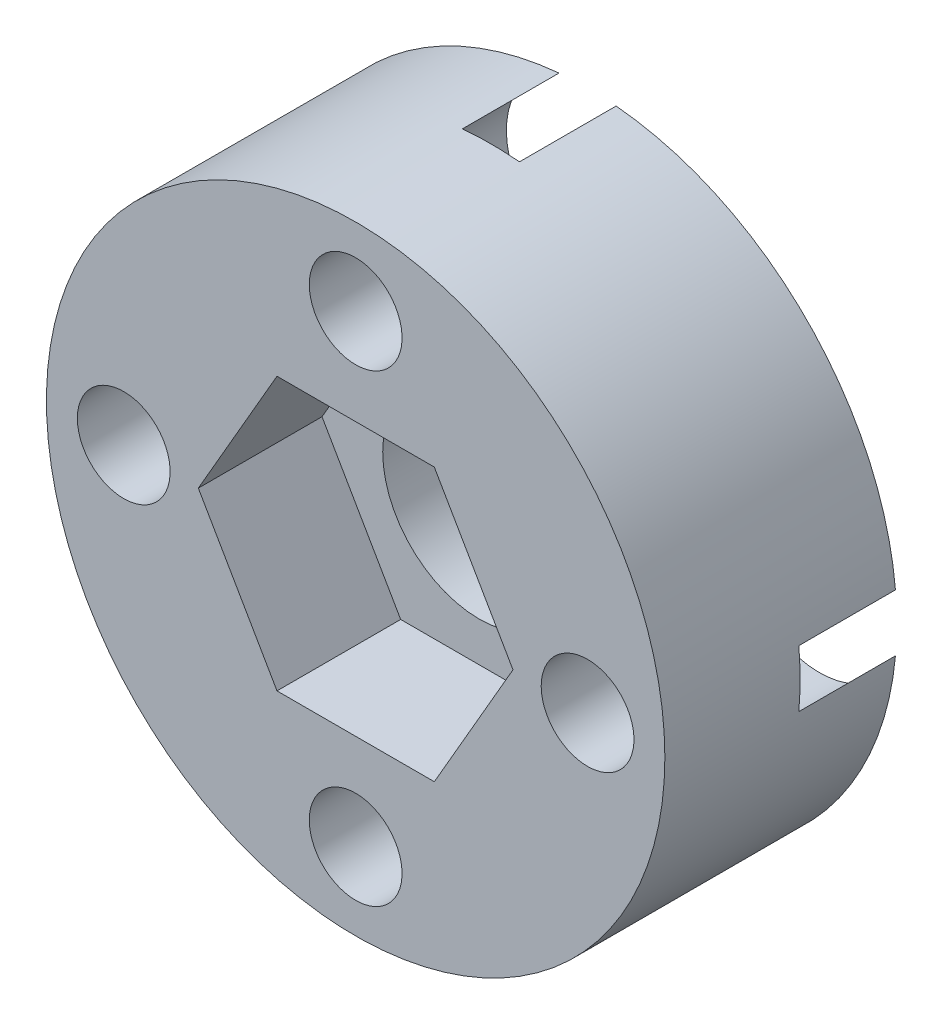
ISO-10303-21;
HEADER;
FILE_DESCRIPTION(('STEP AP214'),'2;1');
FILE_NAME('part.step','',(''),(''),'','','');
FILE_SCHEMA(('AUTOMOTIVE_DESIGN { 1 0 10303 214 1 1 1 1 }'));
ENDSEC;
DATA;
#1=APPLICATION_CONTEXT('core data for automotive mechanical design processes');
#2=APPLICATION_PROTOCOL_DEFINITION('international standard','automotive_design',2000,#1);
#3=PRODUCT_CONTEXT('',#1,'mechanical');
#4=PRODUCT('Part','Part','',(#3));
#5=PRODUCT_RELATED_PRODUCT_CATEGORY('part','',(#4));
#6=PRODUCT_DEFINITION_FORMATION('','',#4);
#7=PRODUCT_DEFINITION_CONTEXT('part definition',#1,'design');
#8=PRODUCT_DEFINITION('design','',#6,#7);
#9=PRODUCT_DEFINITION_SHAPE('','',#8);
#10=(LENGTH_UNIT() NAMED_UNIT(*) SI_UNIT(.MILLI.,.METRE.));
#11=(NAMED_UNIT(*) PLANE_ANGLE_UNIT() SI_UNIT($,.RADIAN.));
#12=(NAMED_UNIT(*) SI_UNIT($,.STERADIAN.) SOLID_ANGLE_UNIT());
#13=UNCERTAINTY_MEASURE_WITH_UNIT(LENGTH_MEASURE(1.E-05),#10,'distance_accuracy_value','');
#14=(GEOMETRIC_REPRESENTATION_CONTEXT(3) GLOBAL_UNCERTAINTY_ASSIGNED_CONTEXT((#13)) GLOBAL_UNIT_ASSIGNED_CONTEXT((#10,
#11,#12)) REPRESENTATION_CONTEXT('',''));
#15=CARTESIAN_POINT('',(0.,0.,0.));
#16=DIRECTION('',(0.,0.,1.));
#17=DIRECTION('',(1.,0.,0.));
#18=AXIS2_PLACEMENT_3D('',#15,#16,#17);
#19=CARTESIAN_POINT('',(0.,0.,0.));
#20=DIRECTION('',(0.,0.,1.));
#21=DIRECTION('',(1.,0.,0.));
#22=AXIS2_PLACEMENT_3D('',#19,#20,#21);
#23=PLANE('',#22);
#24=CARTESIAN_POINT('',(0.,0.,0.));
#25=DIRECTION('',(0.,0.,-1.));
#26=DIRECTION('',(-1.,0.,0.));
#27=AXIS2_PLACEMENT_3D('',#24,#25,#26);
#28=CIRCLE('',#27,2.5);
#29=CARTESIAN_POINT('',(-2.5,0.,0.));
#30=VERTEX_POINT('',#29);
#31=EDGE_CURVE('E478',#30,#30,#28,.T.);
#32=ORIENTED_EDGE('',*,*,#31,.F.);
#33=EDGE_LOOP('',(#32));
#34=FACE_BOUND('',#33,.T.);
#35=CARTESIAN_POINT('',(0.,0.,0.));
#36=DIRECTION('',(0.,0.,1.));
#37=DIRECTION('',(1.,0.,0.));
#38=AXIS2_PLACEMENT_3D('',#35,#36,#37);
#39=CIRCLE('',#38,8.);
#40=CARTESIAN_POINT('',(-0.738579247986072,7.96583333333333,0.));
#41=VERTEX_POINT('',#40);
#42=CARTESIAN_POINT('',(-7.96583333333333,0.738579247985989,0.));
#43=VERTEX_POINT('',#42);
#44=EDGE_CURVE('E159',#41,#43,#39,.T.);
#45=ORIENTED_EDGE('',*,*,#44,.F.);
#46=CARTESIAN_POINT('',(0.,6.,0.));
#47=DIRECTION('',(0.,0.,-1.));
#48=DIRECTION('',(-1.,0.,0.));
#49=AXIS2_PLACEMENT_3D('',#46,#47,#48);
#50=CIRCLE('',#49,2.1);
#51=CARTESIAN_POINT('',(0.738579247985906,7.96583333333334,0.));
#52=VERTEX_POINT('',#51);
#53=EDGE_CURVE('E149',#52,#41,#50,.T.);
#54=ORIENTED_EDGE('',*,*,#53,.F.);
#55=CARTESIAN_POINT('',(7.96583333333333,0.738579247985989,0.));
#56=VERTEX_POINT('',#55);
#57=EDGE_CURVE('E154',#56,#52,#39,.T.);
#58=ORIENTED_EDGE('',*,*,#57,.F.);
#59=CARTESIAN_POINT('',(6.,0.,0.));
#60=DIRECTION('',(0.,0.,-1.));
#61=DIRECTION('',(-1.,0.,0.));
#62=AXIS2_PLACEMENT_3D('',#59,#60,#61);
#63=CIRCLE('',#62,2.1);
#64=CARTESIAN_POINT('',(7.96583333333334,-0.738579247985988,0.));
#65=VERTEX_POINT('',#64);
#66=EDGE_CURVE('E62',#65,#56,#63,.T.);
#67=ORIENTED_EDGE('',*,*,#66,.F.);
#68=CARTESIAN_POINT('',(0.738579247986017,-7.96583333333333,0.));
#69=VERTEX_POINT('',#68);
#70=EDGE_CURVE('E158',#69,#65,#39,.T.);
#71=ORIENTED_EDGE('',*,*,#70,.F.);
#72=CARTESIAN_POINT('',(0.,-6.,0.));
#73=DIRECTION('',(0.,0.,-1.));
#74=DIRECTION('',(-1.,0.,0.));
#75=AXIS2_PLACEMENT_3D('',#72,#73,#74);
#76=CIRCLE('',#75,2.1);
#77=CARTESIAN_POINT('',(-0.738579247985961,-7.96583333333334,0.));
#78=VERTEX_POINT('',#77);
#79=EDGE_CURVE('E172',#78,#69,#76,.T.);
#80=ORIENTED_EDGE('',*,*,#79,.F.);
#81=CARTESIAN_POINT('',(-7.96583333333334,-0.73857924798599,0.));
#82=VERTEX_POINT('',#81);
#83=EDGE_CURVE('E162',#82,#78,#39,.T.);
#84=ORIENTED_EDGE('',*,*,#83,.F.);
#85=CARTESIAN_POINT('',(-6.,0.,0.));
#86=DIRECTION('',(0.,0.,-1.));
#87=DIRECTION('',(-1.,0.,0.));
#88=AXIS2_PLACEMENT_3D('',#85,#86,#87);
#89=CIRCLE('',#88,2.1);
#90=EDGE_CURVE('E186',#43,#82,#89,.T.);
#91=ORIENTED_EDGE('',*,*,#90,.F.);
#92=EDGE_LOOP('',(#45,#54,#58,#67,#71,#80,#84,#91));
#93=FACE_BOUND('',#92,.T.);
#94=ADVANCED_FACE('F39',(#34,#93),#23,.F.);
#95=CARTESIAN_POINT('',(0.,0.,6.));
#96=DIRECTION('',(0.,0.,-1.));
#97=DIRECTION('',(-1.,0.,0.));
#98=AXIS2_PLACEMENT_3D('',#95,#96,#97);
#99=CYLINDRICAL_SURFACE('',#98,8.);
#100=ORIENTED_EDGE('',*,*,#57,.T.);
#101=DIRECTION('',(0.,0.,-1.));
#102=VECTOR('',#101,1.);
#103=CARTESIAN_POINT('',(0.738579247985906,7.96583333333334,1.25));
#104=LINE('',#103,#102);
#105=CARTESIAN_POINT('',(0.738579247985911,7.96583333333334,2.5));
#106=VERTEX_POINT('',#105);
#107=EDGE_CURVE('E11',#52,#106,#104,.F.);
#108=ORIENTED_EDGE('',*,*,#107,.T.);
#109=CARTESIAN_POINT('',(0.,0.,2.5));
#110=DIRECTION('',(0.,0.,1.));
#111=DIRECTION('',(1.,0.,0.));
#112=AXIS2_PLACEMENT_3D('',#109,#110,#111);
#113=CIRCLE('',#112,8.);
#114=CARTESIAN_POINT('',(-0.738579247986077,7.96583333333332,2.5));
#115=VERTEX_POINT('',#114);
#116=EDGE_CURVE('E139',#106,#115,#113,.T.);
#117=ORIENTED_EDGE('',*,*,#116,.T.);
#118=DIRECTION('',(0.,0.,-1.));
#119=VECTOR('',#118,1.);
#120=CARTESIAN_POINT('',(-0.738579247986073,7.96583333333333,1.25));
#121=LINE('',#120,#119);
#122=EDGE_CURVE('E48',#115,#41,#121,.T.);
#123=ORIENTED_EDGE('',*,*,#122,.T.);
#124=ORIENTED_EDGE('',*,*,#44,.T.);
#125=DIRECTION('',(0.,0.,-1.));
#126=VECTOR('',#125,1.);
#127=CARTESIAN_POINT('',(-7.96583333333334,0.73857924798599,1.25));
#128=LINE('',#127,#126);
#129=CARTESIAN_POINT('',(-7.96583333333333,0.738579247985994,2.5));
#130=VERTEX_POINT('',#129);
#131=EDGE_CURVE('E208',#43,#130,#128,.F.);
#132=ORIENTED_EDGE('',*,*,#131,.T.);
#133=CARTESIAN_POINT('',(0.,0.,2.5));
#134=DIRECTION('',(0.,0.,1.));
#135=DIRECTION('',(1.,0.,0.));
#136=AXIS2_PLACEMENT_3D('',#133,#134,#135);
#137=CIRCLE('',#136,8.);
#138=CARTESIAN_POINT('',(-7.96583333333333,-0.738579247985994,2.5));
#139=VERTEX_POINT('',#138);
#140=EDGE_CURVE('E169',#130,#139,#137,.T.);
#141=ORIENTED_EDGE('',*,*,#140,.T.);
#142=DIRECTION('',(0.,0.,-1.));
#143=VECTOR('',#142,1.);
#144=CARTESIAN_POINT('',(-7.96583333333334,-0.73857924798599,1.25));
#145=LINE('',#144,#143);
#146=EDGE_CURVE('E206',#139,#82,#145,.T.);
#147=ORIENTED_EDGE('',*,*,#146,.T.);
#148=ORIENTED_EDGE('',*,*,#83,.T.);
#149=DIRECTION('',(0.,0.,-1.));
#150=VECTOR('',#149,1.);
#151=CARTESIAN_POINT('',(-0.738579247985962,-7.96583333333334,1.25));
#152=LINE('',#151,#150);
#153=CARTESIAN_POINT('',(-0.738579247985967,-7.96583333333334,2.5));
#154=VERTEX_POINT('',#153);
#155=EDGE_CURVE('E191',#78,#154,#152,.F.);
#156=ORIENTED_EDGE('',*,*,#155,.T.);
#157=CARTESIAN_POINT('',(0.,0.,2.5));
#158=DIRECTION('',(0.,0.,1.));
#159=DIRECTION('',(1.,0.,0.));
#160=AXIS2_PLACEMENT_3D('',#157,#158,#159);
#161=CIRCLE('',#160,8.);
#162=CARTESIAN_POINT('',(0.738579247986022,-7.96583333333333,2.5));
#163=VERTEX_POINT('',#162);
#164=EDGE_CURVE('E173',#154,#163,#161,.T.);
#165=ORIENTED_EDGE('',*,*,#164,.T.);
#166=DIRECTION('',(0.,0.,-1.));
#167=VECTOR('',#166,1.);
#168=CARTESIAN_POINT('',(0.738579247986017,-7.96583333333333,1.25));
#169=LINE('',#168,#167);
#170=EDGE_CURVE('E197',#163,#69,#169,.T.);
#171=ORIENTED_EDGE('',*,*,#170,.T.);
#172=ORIENTED_EDGE('',*,*,#70,.T.);
#173=DIRECTION('',(0.,0.,-1.));
#174=VECTOR('',#173,1.);
#175=CARTESIAN_POINT('',(7.96583333333334,-0.738579247985989,1.25));
#176=LINE('',#175,#174);
#177=CARTESIAN_POINT('',(7.96583333333334,-0.738579247985988,2.5));
#178=VERTEX_POINT('',#177);
#179=EDGE_CURVE('E143',#65,#178,#176,.F.);
#180=ORIENTED_EDGE('',*,*,#179,.T.);
#181=CARTESIAN_POINT('',(0.,0.,2.5));
#182=DIRECTION('',(0.,0.,1.));
#183=DIRECTION('',(1.,0.,0.));
#184=AXIS2_PLACEMENT_3D('',#181,#182,#183);
#185=CIRCLE('',#184,8.);
#186=CARTESIAN_POINT('',(7.96583333333334,0.738579247985989,2.5));
#187=VERTEX_POINT('',#186);
#188=EDGE_CURVE('E177',#178,#187,#185,.T.);
#189=ORIENTED_EDGE('',*,*,#188,.T.);
#190=DIRECTION('',(0.,0.,-1.));
#191=VECTOR('',#190,1.);
#192=CARTESIAN_POINT('',(7.96583333333334,0.738579247985989,1.25));
#193=LINE('',#192,#191);
#194=EDGE_CURVE('E156',#187,#56,#193,.T.);
#195=ORIENTED_EDGE('',*,*,#194,.T.);
#196=EDGE_LOOP('',(#100,#108,#117,#123,#124,#132,#141,#147,#148,#156,#165,#171,#172,#180,#189,#195));
#197=FACE_BOUND('',#196,.T.);
#198=CARTESIAN_POINT('',(0.,0.,6.));
#199=DIRECTION('',(0.,0.,1.));
#200=DIRECTION('',(1.,0.,0.));
#201=AXIS2_PLACEMENT_3D('',#198,#199,#200);
#202=CIRCLE('',#201,8.);
#203=CARTESIAN_POINT('',(8.,0.,6.));
#204=VERTEX_POINT('',#203);
#205=EDGE_CURVE('E167',#204,#204,#202,.T.);
#206=ORIENTED_EDGE('',*,*,#205,.F.);
#207=EDGE_LOOP('',(#206));
#208=FACE_BOUND('',#207,.T.);
#209=ADVANCED_FACE('F41',(#197,#208),#99,.T.);
#210=CARTESIAN_POINT('',(0.,0.,6.));
#211=DIRECTION('',(0.,0.,1.));
#212=DIRECTION('',(1.,0.,0.));
#213=AXIS2_PLACEMENT_3D('',#210,#211,#212);
#214=PLANE('',#213);
#215=CARTESIAN_POINT('',(0.,6.,6.));
#216=DIRECTION('',(0.,0.,-1.));
#217=DIRECTION('',(-1.,0.,0.));
#218=AXIS2_PLACEMENT_3D('',#215,#216,#217);
#219=CIRCLE('',#218,1.2);
#220=CARTESIAN_POINT('',(-1.20000000000006,6.,6.));
#221=VERTEX_POINT('',#220);
#222=EDGE_CURVE('E484',#221,#221,#219,.T.);
#223=ORIENTED_EDGE('',*,*,#222,.T.);
#224=EDGE_LOOP('',(#223));
#225=FACE_BOUND('',#224,.T.);
#226=CARTESIAN_POINT('',(6.,0.,6.));
#227=DIRECTION('',(0.,0.,-1.));
#228=DIRECTION('',(-1.,0.,0.));
#229=AXIS2_PLACEMENT_3D('',#226,#227,#228);
#230=CIRCLE('',#229,1.2);
#231=CARTESIAN_POINT('',(4.8,0.,6.));
#232=VERTEX_POINT('',#231);
#233=EDGE_CURVE('E494',#232,#232,#230,.T.);
#234=ORIENTED_EDGE('',*,*,#233,.T.);
#235=EDGE_LOOP('',(#234));
#236=FACE_BOUND('',#235,.T.);
#237=CARTESIAN_POINT('',(0.,-6.,6.));
#238=DIRECTION('',(0.,0.,-1.));
#239=DIRECTION('',(-1.,0.,0.));
#240=AXIS2_PLACEMENT_3D('',#237,#238,#239);
#241=CIRCLE('',#240,1.2);
#242=CARTESIAN_POINT('',(-1.19999999999998,-6.,6.));
#243=VERTEX_POINT('',#242);
#244=EDGE_CURVE('E504',#243,#243,#241,.T.);
#245=ORIENTED_EDGE('',*,*,#244,.T.);
#246=EDGE_LOOP('',(#245));
#247=FACE_BOUND('',#246,.T.);
#248=CARTESIAN_POINT('',(-6.,0.,6.));
#249=DIRECTION('',(0.,0.,-1.));
#250=DIRECTION('',(-1.,0.,0.));
#251=AXIS2_PLACEMENT_3D('',#248,#249,#250);
#252=CIRCLE('',#251,1.2);
#253=CARTESIAN_POINT('',(-7.2,0.,6.));
#254=VERTEX_POINT('',#253);
#255=EDGE_CURVE('E203',#254,#254,#252,.T.);
#256=ORIENTED_EDGE('',*,*,#255,.T.);
#257=EDGE_LOOP('',(#256));
#258=FACE_BOUND('',#257,.T.);
#259=DIRECTION('',(0.5,0.866025403784439,0.));
#260=VECTOR('',#259,1.);
#261=CARTESIAN_POINT('',(2.03515969889343,-3.525,6.));
#262=LINE('',#261,#260);
#263=CARTESIAN_POINT('',(2.03515969889343,-3.525,6.));
#264=VERTEX_POINT('',#263);
#265=CARTESIAN_POINT('',(4.07031939778686,0.,6.));
#266=VERTEX_POINT('',#265);
#267=EDGE_CURVE('E210',#264,#266,#262,.T.);
#268=ORIENTED_EDGE('',*,*,#267,.F.);
#269=DIRECTION('',(1.,0.,0.));
#270=VECTOR('',#269,1.);
#271=CARTESIAN_POINT('',(-2.03515969889343,-3.525,6.));
#272=LINE('',#271,#270);
#273=CARTESIAN_POINT('',(-2.03515969889343,-3.525,6.));
#274=VERTEX_POINT('',#273);
#275=EDGE_CURVE('E215',#274,#264,#272,.T.);
#276=ORIENTED_EDGE('',*,*,#275,.F.);
#277=DIRECTION('',(0.5,-0.866025403784439,0.));
#278=VECTOR('',#277,1.);
#279=CARTESIAN_POINT('',(-4.07031939778686,0.,6.));
#280=LINE('',#279,#278);
#281=CARTESIAN_POINT('',(-4.07031939778686,0.,6.));
#282=VERTEX_POINT('',#281);
#283=EDGE_CURVE('E241',#282,#274,#280,.T.);
#284=ORIENTED_EDGE('',*,*,#283,.F.);
#285=DIRECTION('',(-0.5,-0.866025403784439,0.));
#286=VECTOR('',#285,1.);
#287=CARTESIAN_POINT('',(-2.03515969889343,3.525,6.));
#288=LINE('',#287,#286);
#289=CARTESIAN_POINT('',(-2.03515969889343,3.525,6.));
#290=VERTEX_POINT('',#289);
#291=EDGE_CURVE('E238',#290,#282,#288,.T.);
#292=ORIENTED_EDGE('',*,*,#291,.F.);
#293=DIRECTION('',(-1.,0.,0.));
#294=VECTOR('',#293,1.);
#295=CARTESIAN_POINT('',(2.03515969889343,3.525,6.));
#296=LINE('',#295,#294);
#297=CARTESIAN_POINT('',(2.03515969889343,3.525,6.));
#298=VERTEX_POINT('',#297);
#299=EDGE_CURVE('E235',#298,#290,#296,.T.);
#300=ORIENTED_EDGE('',*,*,#299,.F.);
#301=DIRECTION('',(-0.5,0.866025403784439,0.));
#302=VECTOR('',#301,1.);
#303=CARTESIAN_POINT('',(4.07031939778686,0.,6.));
#304=LINE('',#303,#302);
#305=EDGE_CURVE('E232',#266,#298,#304,.T.);
#306=ORIENTED_EDGE('',*,*,#305,.F.);
#307=EDGE_LOOP('',(#268,#276,#284,#292,#300,#306));
#308=FACE_BOUND('',#307,.T.);
#309=ORIENTED_EDGE('',*,*,#205,.T.);
#310=EDGE_LOOP('',(#309));
#311=FACE_BOUND('',#310,.T.);
#312=ADVANCED_FACE('F264',(#225,#236,#247,#258,#308,#311),#214,.T.);
#313=CARTESIAN_POINT('',(2.03515969889343,-3.525,2.8));
#314=DIRECTION('',(0.866025403784439,-0.5,0.));
#315=DIRECTION('',(0.5,0.866025403784439,0.));
#316=AXIS2_PLACEMENT_3D('',#313,#314,#315);
#317=PLANE('',#316);
#318=ORIENTED_EDGE('',*,*,#267,.T.);
#319=DIRECTION('',(0.,0.,1.));
#320=VECTOR('',#319,1.);
#321=CARTESIAN_POINT('',(4.07031939778686,0.,2.8));
#322=LINE('',#321,#320);
#323=CARTESIAN_POINT('',(4.07031939778686,0.,2.8));
#324=VERTEX_POINT('',#323);
#325=EDGE_CURVE('E230',#324,#266,#322,.T.);
#326=ORIENTED_EDGE('',*,*,#325,.F.);
#327=DIRECTION('',(0.5,0.866025403784439,0.));
#328=VECTOR('',#327,1.);
#329=CARTESIAN_POINT('',(2.03515969889343,-3.525,2.8));
#330=LINE('',#329,#328);
#331=CARTESIAN_POINT('',(2.03515969889343,-3.525,2.8));
#332=VERTEX_POINT('',#331);
#333=EDGE_CURVE('E211',#332,#324,#330,.T.);
#334=ORIENTED_EDGE('',*,*,#333,.F.);
#335=DIRECTION('',(0.,0.,1.));
#336=VECTOR('',#335,1.);
#337=CARTESIAN_POINT('',(2.03515969889343,-3.525,2.8));
#338=LINE('',#337,#336);
#339=EDGE_CURVE('E163',#332,#264,#338,.T.);
#340=ORIENTED_EDGE('',*,*,#339,.T.);
#341=EDGE_LOOP('',(#318,#326,#334,#340));
#342=FACE_BOUND('',#341,.T.);
#343=ADVANCED_FACE('F276',(#342),#317,.F.);
#344=CARTESIAN_POINT('',(-2.03515969889343,-3.525,2.8));
#345=DIRECTION('',(0.,-1.,0.));
#346=DIRECTION('',(1.,0.,0.));
#347=AXIS2_PLACEMENT_3D('',#344,#345,#346);
#348=PLANE('',#347);
#349=ORIENTED_EDGE('',*,*,#275,.T.);
#350=ORIENTED_EDGE('',*,*,#339,.F.);
#351=DIRECTION('',(1.,0.,0.));
#352=VECTOR('',#351,1.);
#353=CARTESIAN_POINT('',(-2.03515969889343,-3.525,2.8));
#354=LINE('',#353,#352);
#355=CARTESIAN_POINT('',(-2.03515969889343,-3.525,2.8));
#356=VERTEX_POINT('',#355);
#357=EDGE_CURVE('E227',#356,#332,#354,.T.);
#358=ORIENTED_EDGE('',*,*,#357,.F.);
#359=DIRECTION('',(0.,0.,1.));
#360=VECTOR('',#359,1.);
#361=CARTESIAN_POINT('',(-2.03515969889343,-3.525,2.8));
#362=LINE('',#361,#360);
#363=EDGE_CURVE('E247',#356,#274,#362,.T.);
#364=ORIENTED_EDGE('',*,*,#363,.T.);
#365=EDGE_LOOP('',(#349,#350,#358,#364));
#366=FACE_BOUND('',#365,.T.);
#367=ADVANCED_FACE('F278',(#366),#348,.F.);
#368=CARTESIAN_POINT('',(-4.07031939778686,0.,2.8));
#369=DIRECTION('',(-0.866025403784439,-0.5,0.));
#370=DIRECTION('',(0.5,-0.866025403784439,0.));
#371=AXIS2_PLACEMENT_3D('',#368,#369,#370);
#372=PLANE('',#371);
#373=ORIENTED_EDGE('',*,*,#283,.T.);
#374=ORIENTED_EDGE('',*,*,#363,.F.);
#375=DIRECTION('',(0.5,-0.866025403784439,0.));
#376=VECTOR('',#375,1.);
#377=CARTESIAN_POINT('',(-4.07031939778686,0.,2.8));
#378=LINE('',#377,#376);
#379=CARTESIAN_POINT('',(-4.07031939778686,0.,2.8));
#380=VERTEX_POINT('',#379);
#381=EDGE_CURVE('E224',#380,#356,#378,.T.);
#382=ORIENTED_EDGE('',*,*,#381,.F.);
#383=DIRECTION('',(0.,0.,1.));
#384=VECTOR('',#383,1.);
#385=CARTESIAN_POINT('',(-4.07031939778686,0.,2.8));
#386=LINE('',#385,#384);
#387=EDGE_CURVE('E249',#380,#282,#386,.T.);
#388=ORIENTED_EDGE('',*,*,#387,.T.);
#389=EDGE_LOOP('',(#373,#374,#382,#388));
#390=FACE_BOUND('',#389,.T.);
#391=ADVANCED_FACE('F280',(#390),#372,.F.);
#392=CARTESIAN_POINT('',(-2.03515969889343,3.525,2.8));
#393=DIRECTION('',(-0.866025403784439,0.5,0.));
#394=DIRECTION('',(-0.5,-0.866025403784439,0.));
#395=AXIS2_PLACEMENT_3D('',#392,#393,#394);
#396=PLANE('',#395);
#397=ORIENTED_EDGE('',*,*,#291,.T.);
#398=ORIENTED_EDGE('',*,*,#387,.F.);
#399=DIRECTION('',(-0.5,-0.866025403784439,0.));
#400=VECTOR('',#399,1.);
#401=CARTESIAN_POINT('',(-2.03515969889343,3.525,2.8));
#402=LINE('',#401,#400);
#403=CARTESIAN_POINT('',(-2.03515969889343,3.525,2.8));
#404=VERTEX_POINT('',#403);
#405=EDGE_CURVE('E221',#404,#380,#402,.T.);
#406=ORIENTED_EDGE('',*,*,#405,.F.);
#407=DIRECTION('',(0.,0.,1.));
#408=VECTOR('',#407,1.);
#409=CARTESIAN_POINT('',(-2.03515969889343,3.525,2.8));
#410=LINE('',#409,#408);
#411=EDGE_CURVE('E251',#404,#290,#410,.T.);
#412=ORIENTED_EDGE('',*,*,#411,.T.);
#413=EDGE_LOOP('',(#397,#398,#406,#412));
#414=FACE_BOUND('',#413,.T.);
#415=ADVANCED_FACE('F283',(#414),#396,.F.);
#416=CARTESIAN_POINT('',(2.03515969889343,3.525,2.8));
#417=DIRECTION('',(0.,1.,0.));
#418=DIRECTION('',(0.,0.,1.));
#419=AXIS2_PLACEMENT_3D('',#416,#417,#418);
#420=PLANE('',#419);
#421=ORIENTED_EDGE('',*,*,#299,.T.);
#422=ORIENTED_EDGE('',*,*,#411,.F.);
#423=DIRECTION('',(-1.,0.,0.));
#424=VECTOR('',#423,1.);
#425=CARTESIAN_POINT('',(2.03515969889343,3.525,2.8));
#426=LINE('',#425,#424);
#427=CARTESIAN_POINT('',(2.03515969889343,3.525,2.8));
#428=VERTEX_POINT('',#427);
#429=EDGE_CURVE('E218',#428,#404,#426,.T.);
#430=ORIENTED_EDGE('',*,*,#429,.F.);
#431=DIRECTION('',(0.,0.,1.));
#432=VECTOR('',#431,1.);
#433=CARTESIAN_POINT('',(2.03515969889343,3.525,2.8));
#434=LINE('',#433,#432);
#435=EDGE_CURVE('E253',#428,#298,#434,.T.);
#436=ORIENTED_EDGE('',*,*,#435,.T.);
#437=EDGE_LOOP('',(#421,#422,#430,#436));
#438=FACE_BOUND('',#437,.T.);
#439=ADVANCED_FACE('F270',(#438),#420,.F.);
#440=CARTESIAN_POINT('',(4.07031939778686,0.,2.8));
#441=DIRECTION('',(0.866025403784439,0.5,0.));
#442=DIRECTION('',(-0.5,0.866025403784439,0.));
#443=AXIS2_PLACEMENT_3D('',#440,#441,#442);
#444=PLANE('',#443);
#445=ORIENTED_EDGE('',*,*,#305,.T.);
#446=ORIENTED_EDGE('',*,*,#435,.F.);
#447=DIRECTION('',(-0.5,0.866025403784439,0.));
#448=VECTOR('',#447,1.);
#449=CARTESIAN_POINT('',(4.07031939778686,0.,2.8));
#450=LINE('',#449,#448);
#451=EDGE_CURVE('E214',#324,#428,#450,.T.);
#452=ORIENTED_EDGE('',*,*,#451,.F.);
#453=ORIENTED_EDGE('',*,*,#325,.T.);
#454=EDGE_LOOP('',(#445,#446,#452,#453));
#455=FACE_BOUND('',#454,.T.);
#456=ADVANCED_FACE('F258',(#455),#444,.F.);
#457=CARTESIAN_POINT('',(0.,0.,2.8));
#458=DIRECTION('',(0.,0.,1.));
#459=DIRECTION('',(1.,0.,0.));
#460=AXIS2_PLACEMENT_3D('',#457,#458,#459);
#461=PLANE('',#460);
#462=CARTESIAN_POINT('',(0.,0.,2.8));
#463=DIRECTION('',(0.,0.,1.));
#464=DIRECTION('',(1.,0.,0.));
#465=AXIS2_PLACEMENT_3D('',#462,#463,#464);
#466=CIRCLE('',#465,2.5);
#467=CARTESIAN_POINT('',(2.5,0.,2.8));
#468=VERTEX_POINT('',#467);
#469=EDGE_CURVE('E43',#468,#468,#466,.T.);
#470=ORIENTED_EDGE('',*,*,#469,.F.);
#471=EDGE_LOOP('',(#470));
#472=FACE_BOUND('',#471,.T.);
#473=ORIENTED_EDGE('',*,*,#333,.T.);
#474=ORIENTED_EDGE('',*,*,#451,.T.);
#475=ORIENTED_EDGE('',*,*,#429,.T.);
#476=ORIENTED_EDGE('',*,*,#405,.T.);
#477=ORIENTED_EDGE('',*,*,#381,.T.);
#478=ORIENTED_EDGE('',*,*,#357,.T.);
#479=EDGE_LOOP('',(#473,#474,#475,#476,#477,#478));
#480=FACE_BOUND('',#479,.T.);
#481=ADVANCED_FACE('F274',(#472,#480),#461,.T.);
#482=CARTESIAN_POINT('',(-4.8,0.,2.5));
#483=DIRECTION('',(0.,0.,1.));
#484=DIRECTION('',(1.,0.,0.));
#485=AXIS2_PLACEMENT_3D('',#482,#483,#484);
#486=PLANE('',#485);
#487=CARTESIAN_POINT('',(-6.,0.,2.5));
#488=DIRECTION('',(0.,0.,-1.));
#489=DIRECTION('',(-1.,0.,0.));
#490=AXIS2_PLACEMENT_3D('',#487,#488,#489);
#491=CIRCLE('',#490,1.2);
#492=CARTESIAN_POINT('',(-7.2,0.,2.5));
#493=VERTEX_POINT('',#492);
#494=EDGE_CURVE('E194',#493,#493,#491,.T.);
#495=ORIENTED_EDGE('',*,*,#494,.F.);
#496=EDGE_LOOP('',(#495));
#497=FACE_BOUND('',#496,.T.);
#498=CARTESIAN_POINT('',(-6.,0.,2.5));
#499=DIRECTION('',(0.,0.,-1.));
#500=DIRECTION('',(-1.,0.,0.));
#501=AXIS2_PLACEMENT_3D('',#498,#499,#500);
#502=CIRCLE('',#501,2.1);
#503=EDGE_CURVE('E190',#130,#139,#502,.T.);
#504=ORIENTED_EDGE('',*,*,#503,.T.);
#505=ORIENTED_EDGE('',*,*,#140,.F.);
#506=EDGE_LOOP('',(#504,#505));
#507=FACE_BOUND('',#506,.T.);
#508=ADVANCED_FACE('F310',(#497,#507),#486,.F.);
#509=CARTESIAN_POINT('',(-6.,0.,0.));
#510=DIRECTION('',(0.,0.,-1.));
#511=DIRECTION('',(-1.,0.,0.));
#512=AXIS2_PLACEMENT_3D('',#509,#510,#511);
#513=CYLINDRICAL_SURFACE('',#512,2.1);
#514=ORIENTED_EDGE('',*,*,#90,.T.);
#515=ORIENTED_EDGE('',*,*,#146,.F.);
#516=ORIENTED_EDGE('',*,*,#503,.F.);
#517=ORIENTED_EDGE('',*,*,#131,.F.);
#518=EDGE_LOOP('',(#514,#515,#516,#517));
#519=FACE_BOUND('',#518,.T.);
#520=ADVANCED_FACE('F316',(#519),#513,.F.);
#521=CARTESIAN_POINT('',(-6.,0.,0.));
#522=DIRECTION('',(0.,0.,-1.));
#523=DIRECTION('',(-1.,0.,0.));
#524=AXIS2_PLACEMENT_3D('',#521,#522,#523);
#525=CYLINDRICAL_SURFACE('',#524,1.2);
#526=ORIENTED_EDGE('',*,*,#255,.F.);
#527=EDGE_LOOP('',(#526));
#528=FACE_BOUND('',#527,.T.);
#529=ORIENTED_EDGE('',*,*,#494,.T.);
#530=EDGE_LOOP('',(#529));
#531=FACE_BOUND('',#530,.T.);
#532=ADVANCED_FACE('F322',(#528,#531),#525,.F.);
#533=CARTESIAN_POINT('',(1.20000000000002,-6.,2.5));
#534=DIRECTION('',(0.,0.,1.));
#535=DIRECTION('',(1.,0.,0.));
#536=AXIS2_PLACEMENT_3D('',#533,#534,#535);
#537=PLANE('',#536);
#538=CARTESIAN_POINT('',(0.,-6.,2.5));
#539=DIRECTION('',(0.,0.,-1.));
#540=DIRECTION('',(-1.,0.,0.));
#541=AXIS2_PLACEMENT_3D('',#538,#539,#540);
#542=CIRCLE('',#541,1.2);
#543=CARTESIAN_POINT('',(-1.19999999999998,-6.,2.5));
#544=VERTEX_POINT('',#543);
#545=EDGE_CURVE('E501',#544,#544,#542,.T.);
#546=ORIENTED_EDGE('',*,*,#545,.F.);
#547=EDGE_LOOP('',(#546));
#548=FACE_BOUND('',#547,.T.);
#549=CARTESIAN_POINT('',(0.,-6.,2.5));
#550=DIRECTION('',(0.,0.,-1.));
#551=DIRECTION('',(-1.,0.,0.));
#552=AXIS2_PLACEMENT_3D('',#549,#550,#551);
#553=CIRCLE('',#552,2.1);
#554=EDGE_CURVE('E497',#154,#163,#553,.T.);
#555=ORIENTED_EDGE('',*,*,#554,.T.);
#556=ORIENTED_EDGE('',*,*,#164,.F.);
#557=EDGE_LOOP('',(#555,#556));
#558=FACE_BOUND('',#557,.T.);
#559=ADVANCED_FACE('F375',(#548,#558),#537,.F.);
#560=CARTESIAN_POINT('',(0.,-6.,0.));
#561=DIRECTION('',(0.,0.,-1.));
#562=DIRECTION('',(-1.,0.,0.));
#563=AXIS2_PLACEMENT_3D('',#560,#561,#562);
#564=CYLINDRICAL_SURFACE('',#563,2.1);
#565=ORIENTED_EDGE('',*,*,#79,.T.);
#566=ORIENTED_EDGE('',*,*,#170,.F.);
#567=ORIENTED_EDGE('',*,*,#554,.F.);
#568=ORIENTED_EDGE('',*,*,#155,.F.);
#569=EDGE_LOOP('',(#565,#566,#567,#568));
#570=FACE_BOUND('',#569,.T.);
#571=ADVANCED_FACE('F388',(#570),#564,.F.);
#572=CARTESIAN_POINT('',(0.,-6.,0.));
#573=DIRECTION('',(0.,0.,-1.));
#574=DIRECTION('',(-1.,0.,0.));
#575=AXIS2_PLACEMENT_3D('',#572,#573,#574);
#576=CYLINDRICAL_SURFACE('',#575,1.2);
#577=ORIENTED_EDGE('',*,*,#244,.F.);
#578=EDGE_LOOP('',(#577));
#579=FACE_BOUND('',#578,.T.);
#580=ORIENTED_EDGE('',*,*,#545,.T.);
#581=EDGE_LOOP('',(#580));
#582=FACE_BOUND('',#581,.T.);
#583=ADVANCED_FACE('F398',(#579,#582),#576,.F.);
#584=CARTESIAN_POINT('',(7.2,0.,2.5));
#585=DIRECTION('',(0.,0.,1.));
#586=DIRECTION('',(1.,0.,0.));
#587=AXIS2_PLACEMENT_3D('',#584,#585,#586);
#588=PLANE('',#587);
#589=CARTESIAN_POINT('',(6.,0.,2.5));
#590=DIRECTION('',(0.,0.,-1.));
#591=DIRECTION('',(-1.,0.,0.));
#592=AXIS2_PLACEMENT_3D('',#589,#590,#591);
#593=CIRCLE('',#592,1.2);
#594=CARTESIAN_POINT('',(4.8,0.,2.5));
#595=VERTEX_POINT('',#594);
#596=EDGE_CURVE('E491',#595,#595,#593,.T.);
#597=ORIENTED_EDGE('',*,*,#596,.F.);
#598=EDGE_LOOP('',(#597));
#599=FACE_BOUND('',#598,.T.);
#600=CARTESIAN_POINT('',(6.,0.,2.5));
#601=DIRECTION('',(0.,0.,-1.));
#602=DIRECTION('',(-1.,0.,0.));
#603=AXIS2_PLACEMENT_3D('',#600,#601,#602);
#604=CIRCLE('',#603,2.1);
#605=EDGE_CURVE('E488',#178,#187,#604,.T.);
#606=ORIENTED_EDGE('',*,*,#605,.T.);
#607=ORIENTED_EDGE('',*,*,#188,.F.);
#608=EDGE_LOOP('',(#606,#607));
#609=FACE_BOUND('',#608,.T.);
#610=ADVANCED_FACE('F408',(#599,#609),#588,.F.);
#611=CARTESIAN_POINT('',(6.,0.,0.));
#612=DIRECTION('',(0.,0.,-1.));
#613=DIRECTION('',(-1.,0.,0.));
#614=AXIS2_PLACEMENT_3D('',#611,#612,#613);
#615=CYLINDRICAL_SURFACE('',#614,2.1);
#616=ORIENTED_EDGE('',*,*,#66,.T.);
#617=ORIENTED_EDGE('',*,*,#194,.F.);
#618=ORIENTED_EDGE('',*,*,#605,.F.);
#619=ORIENTED_EDGE('',*,*,#179,.F.);
#620=EDGE_LOOP('',(#616,#617,#618,#619));
#621=FACE_BOUND('',#620,.T.);
#622=ADVANCED_FACE('F418',(#621),#615,.F.);
#623=CARTESIAN_POINT('',(6.,0.,0.));
#624=DIRECTION('',(0.,0.,-1.));
#625=DIRECTION('',(-1.,0.,0.));
#626=AXIS2_PLACEMENT_3D('',#623,#624,#625);
#627=CYLINDRICAL_SURFACE('',#626,1.2);
#628=ORIENTED_EDGE('',*,*,#233,.F.);
#629=EDGE_LOOP('',(#628));
#630=FACE_BOUND('',#629,.T.);
#631=ORIENTED_EDGE('',*,*,#596,.T.);
#632=EDGE_LOOP('',(#631));
#633=FACE_BOUND('',#632,.T.);
#634=ADVANCED_FACE('F428',(#630,#633),#627,.F.);
#635=CARTESIAN_POINT('',(0.,6.,0.));
#636=DIRECTION('',(0.,0.,-1.));
#637=DIRECTION('',(-1.,0.,0.));
#638=AXIS2_PLACEMENT_3D('',#635,#636,#637);
#639=CYLINDRICAL_SURFACE('',#638,2.1);
#640=ORIENTED_EDGE('',*,*,#53,.T.);
#641=ORIENTED_EDGE('',*,*,#122,.F.);
#642=CARTESIAN_POINT('',(0.,6.,2.5));
#643=DIRECTION('',(0.,0.,-1.));
#644=DIRECTION('',(-1.,0.,0.));
#645=AXIS2_PLACEMENT_3D('',#642,#643,#644);
#646=CIRCLE('',#645,2.1);
#647=EDGE_CURVE('E54',#106,#115,#646,.T.);
#648=ORIENTED_EDGE('',*,*,#647,.F.);
#649=ORIENTED_EDGE('',*,*,#107,.F.);
#650=EDGE_LOOP('',(#640,#641,#648,#649));
#651=FACE_BOUND('',#650,.T.);
#652=ADVANCED_FACE('F146',(#651),#639,.F.);
#653=CARTESIAN_POINT('',(1.19999999999994,6.,2.5));
#654=DIRECTION('',(0.,0.,1.));
#655=DIRECTION('',(1.,0.,0.));
#656=AXIS2_PLACEMENT_3D('',#653,#654,#655);
#657=PLANE('',#656);
#658=CARTESIAN_POINT('',(0.,6.,2.5));
#659=DIRECTION('',(0.,0.,-1.));
#660=DIRECTION('',(-1.,0.,0.));
#661=AXIS2_PLACEMENT_3D('',#658,#659,#660);
#662=CIRCLE('',#661,1.2);
#663=CARTESIAN_POINT('',(-1.20000000000006,6.,2.5));
#664=VERTEX_POINT('',#663);
#665=EDGE_CURVE('E148',#664,#664,#662,.T.);
#666=ORIENTED_EDGE('',*,*,#665,.F.);
#667=EDGE_LOOP('',(#666));
#668=FACE_BOUND('',#667,.T.);
#669=ORIENTED_EDGE('',*,*,#647,.T.);
#670=ORIENTED_EDGE('',*,*,#116,.F.);
#671=EDGE_LOOP('',(#669,#670));
#672=FACE_BOUND('',#671,.T.);
#673=ADVANCED_FACE('F140',(#668,#672),#657,.F.);
#674=CARTESIAN_POINT('',(0.,6.,0.));
#675=DIRECTION('',(0.,0.,-1.));
#676=DIRECTION('',(-1.,0.,0.));
#677=AXIS2_PLACEMENT_3D('',#674,#675,#676);
#678=CYLINDRICAL_SURFACE('',#677,1.2);
#679=ORIENTED_EDGE('',*,*,#222,.F.);
#680=EDGE_LOOP('',(#679));
#681=FACE_BOUND('',#680,.T.);
#682=ORIENTED_EDGE('',*,*,#665,.T.);
#683=EDGE_LOOP('',(#682));
#684=FACE_BOUND('',#683,.T.);
#685=ADVANCED_FACE('F454',(#681,#684),#678,.F.);
#686=CARTESIAN_POINT('',(0.,0.,0.));
#687=DIRECTION('',(0.,0.,-1.));
#688=DIRECTION('',(-1.,0.,0.));
#689=AXIS2_PLACEMENT_3D('',#686,#687,#688);
#690=CYLINDRICAL_SURFACE('',#689,2.5);
#691=ORIENTED_EDGE('',*,*,#469,.T.);
#692=EDGE_LOOP('',(#691));
#693=FACE_BOUND('',#692,.T.);
#694=ORIENTED_EDGE('',*,*,#31,.T.);
#695=EDGE_LOOP('',(#694));
#696=FACE_BOUND('',#695,.T.);
#697=ADVANCED_FACE('F463',(#693,#696),#690,.F.);
#698=CLOSED_SHELL('',(#94,#209,#312,#343,#367,#391,#415,#439,#456,#481,#508,#520,#532,#559,#571,
#583,#610,#622,#634,#652,#673,#685,#697));
#699=MANIFOLD_SOLID_BREP('B2',#698);
#700=ADVANCED_BREP_SHAPE_REPRESENTATION('',(#18,#699),#14);
#701=SHAPE_DEFINITION_REPRESENTATION(#9,#700);
ENDSEC;
END-ISO-10303-21;
